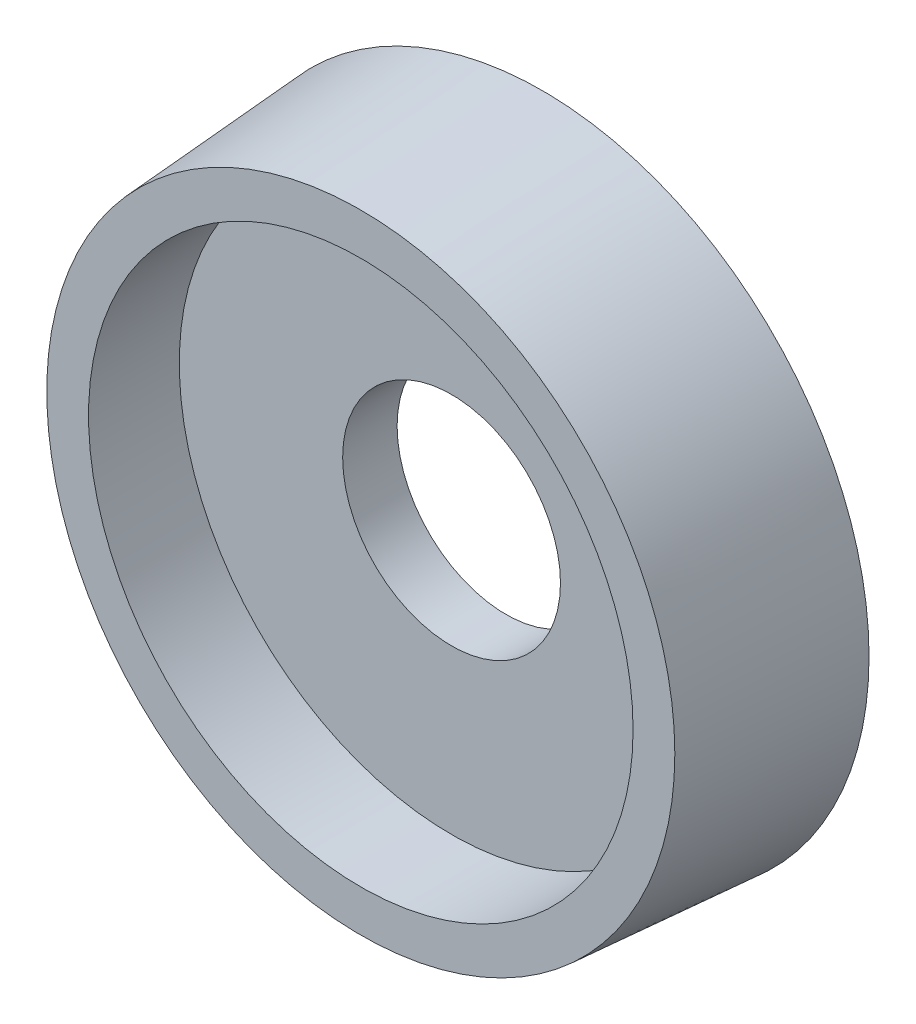
ISO-10303-21;
HEADER;
FILE_DESCRIPTION(('STEP AP214'),'2;1');
FILE_NAME('part.step','',(''),(''),'','','');
FILE_SCHEMA(('AUTOMOTIVE_DESIGN { 1 0 10303 214 1 1 1 1 }'));
ENDSEC;
DATA;
#1=APPLICATION_CONTEXT('core data for automotive mechanical design processes');
#2=APPLICATION_PROTOCOL_DEFINITION('international standard','automotive_design',2000,#1);
#3=PRODUCT_CONTEXT('',#1,'mechanical');
#4=PRODUCT('Part','Part','',(#3));
#5=PRODUCT_RELATED_PRODUCT_CATEGORY('part','',(#4));
#6=PRODUCT_DEFINITION_FORMATION('','',#4);
#7=PRODUCT_DEFINITION_CONTEXT('part definition',#1,'design');
#8=PRODUCT_DEFINITION('design','',#6,#7);
#9=PRODUCT_DEFINITION_SHAPE('','',#8);
#10=(LENGTH_UNIT() NAMED_UNIT(*) SI_UNIT(.MILLI.,.METRE.));
#11=(NAMED_UNIT(*) PLANE_ANGLE_UNIT() SI_UNIT($,.RADIAN.));
#12=(NAMED_UNIT(*) SI_UNIT($,.STERADIAN.) SOLID_ANGLE_UNIT());
#13=UNCERTAINTY_MEASURE_WITH_UNIT(LENGTH_MEASURE(1.E-05),#10,'distance_accuracy_value','');
#14=(GEOMETRIC_REPRESENTATION_CONTEXT(3) GLOBAL_UNCERTAINTY_ASSIGNED_CONTEXT((#13)) GLOBAL_UNIT_ASSIGNED_CONTEXT((#10,
#11,#12)) REPRESENTATION_CONTEXT('',''));
#15=CARTESIAN_POINT('',(0.,0.,0.));
#16=DIRECTION('',(0.,0.,1.));
#17=DIRECTION('',(1.,0.,0.));
#18=AXIS2_PLACEMENT_3D('',#15,#16,#17);
#19=CARTESIAN_POINT('',(0.,0.,0.));
#20=DIRECTION('',(0.,0.,-1.));
#21=DIRECTION('',(1.,0.,0.));
#22=AXIS2_PLACEMENT_3D('',#19,#20,#21);
#23=CONICAL_SURFACE('',#22,9.,0.0698131700797732);
#24=CARTESIAN_POINT('',(0.,0.,5.));
#25=DIRECTION('',(0.,0.,1.));
#26=DIRECTION('',(1.,0.,0.));
#27=AXIS2_PLACEMENT_3D('',#24,#25,#26);
#28=CIRCLE('',#27,8.65036594028244);
#29=CARTESIAN_POINT('',(8.65036594028244,0.,5.));
#30=VERTEX_POINT('',#29);
#31=EDGE_CURVE('E10',#30,#30,#28,.T.);
#32=ORIENTED_EDGE('',*,*,#31,.F.);
#33=EDGE_LOOP('',(#32));
#34=FACE_BOUND('',#33,.T.);
#35=CARTESIAN_POINT('',(0.,0.,0.));
#36=DIRECTION('',(0.,0.,1.));
#37=DIRECTION('',(1.,0.,0.));
#38=AXIS2_PLACEMENT_3D('',#35,#36,#37);
#39=CIRCLE('',#38,9.);
#40=CARTESIAN_POINT('',(9.,0.,0.));
#41=VERTEX_POINT('',#40);
#42=EDGE_CURVE('E45',#41,#41,#39,.T.);
#43=ORIENTED_EDGE('',*,*,#42,.T.);
#44=EDGE_LOOP('',(#43));
#45=FACE_BOUND('',#44,.T.);
#46=ADVANCED_FACE('F37',(#34,#45),#23,.T.);
#47=CARTESIAN_POINT('',(0.,0.,5.));
#48=DIRECTION('',(0.,0.,1.));
#49=DIRECTION('',(1.,0.,0.));
#50=AXIS2_PLACEMENT_3D('',#47,#48,#49);
#51=PLANE('',#50);
#52=CARTESIAN_POINT('',(0.,0.,5.));
#53=DIRECTION('',(0.,0.,1.));
#54=DIRECTION('',(1.,0.,0.));
#55=AXIS2_PLACEMENT_3D('',#52,#53,#54);
#56=CIRCLE('',#55,7.5);
#57=CARTESIAN_POINT('',(7.5,0.,5.));
#58=VERTEX_POINT('',#57);
#59=EDGE_CURVE('E61',#58,#58,#56,.T.);
#60=ORIENTED_EDGE('',*,*,#59,.F.);
#61=EDGE_LOOP('',(#60));
#62=FACE_BOUND('',#61,.T.);
#63=ORIENTED_EDGE('',*,*,#31,.T.);
#64=EDGE_LOOP('',(#63));
#65=FACE_BOUND('',#64,.T.);
#66=ADVANCED_FACE('F92',(#62,#65),#51,.T.);
#67=CARTESIAN_POINT('',(0.,0.,0.));
#68=DIRECTION('',(0.,0.,1.));
#69=DIRECTION('',(1.,0.,0.));
#70=AXIS2_PLACEMENT_3D('',#67,#68,#69);
#71=PLANE('',#70);
#72=CARTESIAN_POINT('',(0.,0.,0.));
#73=DIRECTION('',(0.,0.,-1.));
#74=DIRECTION('',(-1.,0.,0.));
#75=AXIS2_PLACEMENT_3D('',#72,#73,#74);
#76=CIRCLE('',#75,5.);
#77=CARTESIAN_POINT('',(-5.,0.,0.));
#78=VERTEX_POINT('',#77);
#79=EDGE_CURVE('E53',#78,#78,#76,.T.);
#80=ORIENTED_EDGE('',*,*,#79,.F.);
#81=EDGE_LOOP('',(#80));
#82=FACE_BOUND('',#81,.T.);
#83=ORIENTED_EDGE('',*,*,#42,.F.);
#84=EDGE_LOOP('',(#83));
#85=FACE_BOUND('',#84,.T.);
#86=ADVANCED_FACE('F94',(#82,#85),#71,.F.);
#87=CARTESIAN_POINT('',(0.,0.,1.));
#88=DIRECTION('',(0.,0.,-1.));
#89=DIRECTION('',(-1.,0.,0.));
#90=AXIS2_PLACEMENT_3D('',#87,#88,#89);
#91=CYLINDRICAL_SURFACE('',#90,5.);
#92=CARTESIAN_POINT('',(0.,0.,1.));
#93=DIRECTION('',(0.,0.,-1.));
#94=DIRECTION('',(-1.,0.,0.));
#95=AXIS2_PLACEMENT_3D('',#92,#93,#94);
#96=CIRCLE('',#95,5.);
#97=CARTESIAN_POINT('',(-5.,0.,1.));
#98=VERTEX_POINT('',#97);
#99=EDGE_CURVE('E50',#98,#98,#96,.T.);
#100=ORIENTED_EDGE('',*,*,#99,.F.);
#101=EDGE_LOOP('',(#100));
#102=FACE_BOUND('',#101,.T.);
#103=ORIENTED_EDGE('',*,*,#79,.T.);
#104=EDGE_LOOP('',(#103));
#105=FACE_BOUND('',#104,.T.);
#106=ADVANCED_FACE('F100',(#102,#105),#91,.F.);
#107=CARTESIAN_POINT('',(0.,0.,1.));
#108=DIRECTION('',(0.,0.,-1.));
#109=DIRECTION('',(-1.,0.,0.));
#110=AXIS2_PLACEMENT_3D('',#107,#108,#109);
#111=PLANE('',#110);
#112=CARTESIAN_POINT('',(0.,0.,1.));
#113=DIRECTION('',(0.,0.,-1.));
#114=DIRECTION('',(-1.,0.,0.));
#115=AXIS2_PLACEMENT_3D('',#112,#113,#114);
#116=CIRCLE('',#115,3.);
#117=CARTESIAN_POINT('',(-3.,0.,1.));
#118=VERTEX_POINT('',#117);
#119=EDGE_CURVE('E65',#118,#118,#116,.T.);
#120=ORIENTED_EDGE('',*,*,#119,.F.);
#121=EDGE_LOOP('',(#120));
#122=FACE_BOUND('',#121,.T.);
#123=ORIENTED_EDGE('',*,*,#99,.T.);
#124=EDGE_LOOP('',(#123));
#125=FACE_BOUND('',#124,.T.);
#126=ADVANCED_FACE('F88',(#122,#125),#111,.T.);
#127=CARTESIAN_POINT('',(0.,0.,2.5));
#128=DIRECTION('',(0.,0.,1.));
#129=DIRECTION('',(1.,0.,0.));
#130=AXIS2_PLACEMENT_3D('',#127,#128,#129);
#131=CYLINDRICAL_SURFACE('',#130,7.5);
#132=CARTESIAN_POINT('',(0.,0.,2.5));
#133=DIRECTION('',(0.,0.,1.));
#134=DIRECTION('',(1.,0.,0.));
#135=AXIS2_PLACEMENT_3D('',#132,#133,#134);
#136=CIRCLE('',#135,7.5);
#137=CARTESIAN_POINT('',(7.5,0.,2.5));
#138=VERTEX_POINT('',#137);
#139=EDGE_CURVE('E57',#138,#138,#136,.T.);
#140=ORIENTED_EDGE('',*,*,#139,.F.);
#141=EDGE_LOOP('',(#140));
#142=FACE_BOUND('',#141,.T.);
#143=ORIENTED_EDGE('',*,*,#59,.T.);
#144=EDGE_LOOP('',(#143));
#145=FACE_BOUND('',#144,.T.);
#146=ADVANCED_FACE('F82',(#142,#145),#131,.F.);
#147=CARTESIAN_POINT('',(0.,0.,2.5));
#148=DIRECTION('',(0.,0.,1.));
#149=DIRECTION('',(1.,0.,0.));
#150=AXIS2_PLACEMENT_3D('',#147,#148,#149);
#151=PLANE('',#150);
#152=CARTESIAN_POINT('',(0.,0.,2.5));
#153=DIRECTION('',(0.,0.,1.));
#154=DIRECTION('',(1.,0.,0.));
#155=AXIS2_PLACEMENT_3D('',#152,#153,#154);
#156=CIRCLE('',#155,3.);
#157=CARTESIAN_POINT('',(3.,0.,2.5));
#158=VERTEX_POINT('',#157);
#159=EDGE_CURVE('E40',#158,#158,#156,.T.);
#160=ORIENTED_EDGE('',*,*,#159,.F.);
#161=EDGE_LOOP('',(#160));
#162=FACE_BOUND('',#161,.T.);
#163=ORIENTED_EDGE('',*,*,#139,.T.);
#164=EDGE_LOOP('',(#163));
#165=FACE_BOUND('',#164,.T.);
#166=ADVANCED_FACE('F79',(#162,#165),#151,.T.);
#167=CARTESIAN_POINT('',(0.,0.,0.));
#168=DIRECTION('',(0.,0.,1.));
#169=DIRECTION('',(1.,0.,0.));
#170=AXIS2_PLACEMENT_3D('',#167,#168,#169);
#171=CYLINDRICAL_SURFACE('',#170,3.);
#172=ORIENTED_EDGE('',*,*,#119,.T.);
#173=EDGE_LOOP('',(#172));
#174=FACE_BOUND('',#173,.T.);
#175=ORIENTED_EDGE('',*,*,#159,.T.);
#176=EDGE_LOOP('',(#175));
#177=FACE_BOUND('',#176,.T.);
#178=ADVANCED_FACE('F77',(#174,#177),#171,.F.);
#179=CLOSED_SHELL('',(#46,#66,#86,#106,#126,#146,#166,#178));
#180=MANIFOLD_SOLID_BREP('B2',#179);
#181=ADVANCED_BREP_SHAPE_REPRESENTATION('',(#18,#180),#14);
#182=SHAPE_DEFINITION_REPRESENTATION(#9,#181);
ENDSEC;
END-ISO-10303-21;
